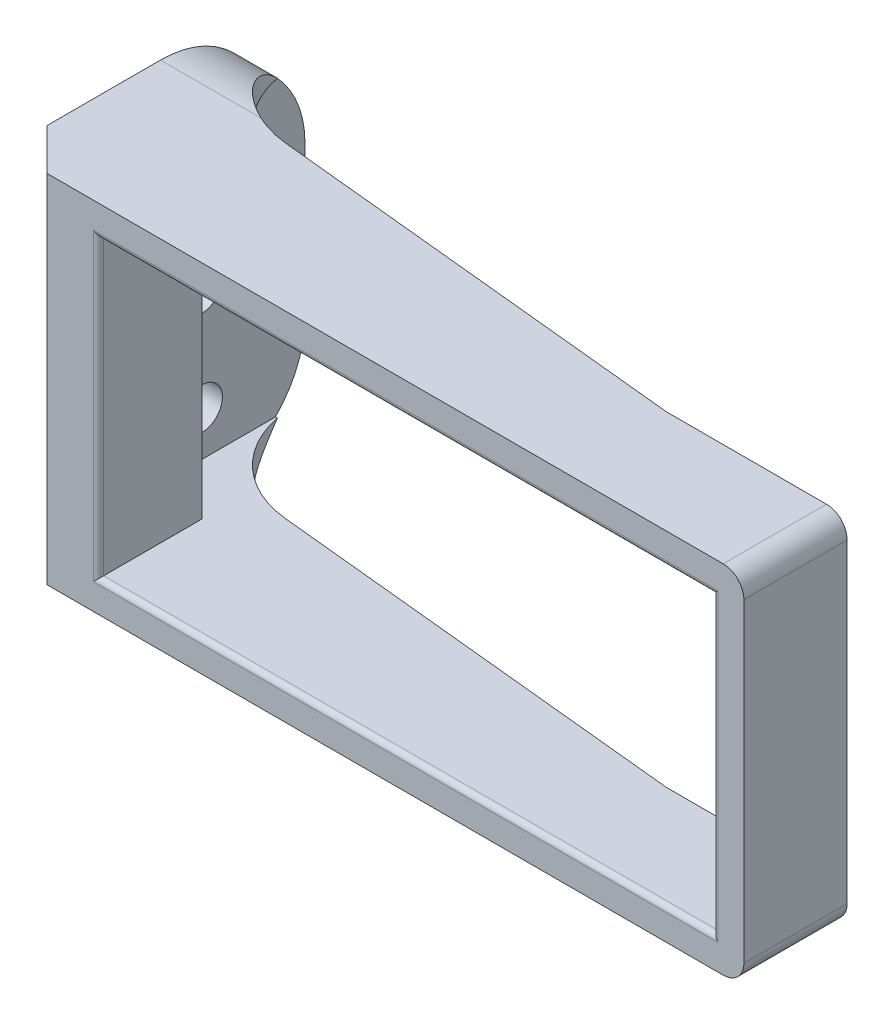
ISO-10303-21;
HEADER;
FILE_DESCRIPTION(('STEP AP214'),'2;1');
FILE_NAME('part.step','',(''),(''),'','','');
FILE_SCHEMA(('AUTOMOTIVE_DESIGN { 1 0 10303 214 1 1 1 1 }'));
ENDSEC;
DATA;
#1=APPLICATION_CONTEXT('core data for automotive mechanical design processes');
#2=APPLICATION_PROTOCOL_DEFINITION('international standard','automotive_design',2000,#1);
#3=PRODUCT_CONTEXT('',#1,'mechanical');
#4=PRODUCT('Part','Part','',(#3));
#5=PRODUCT_RELATED_PRODUCT_CATEGORY('part','',(#4));
#6=PRODUCT_DEFINITION_FORMATION('','',#4);
#7=PRODUCT_DEFINITION_CONTEXT('part definition',#1,'design');
#8=PRODUCT_DEFINITION('design','',#6,#7);
#9=PRODUCT_DEFINITION_SHAPE('','',#8);
#10=(LENGTH_UNIT() NAMED_UNIT(*) SI_UNIT(.MILLI.,.METRE.));
#11=(NAMED_UNIT(*) PLANE_ANGLE_UNIT() SI_UNIT($,.RADIAN.));
#12=(NAMED_UNIT(*) SI_UNIT($,.STERADIAN.) SOLID_ANGLE_UNIT());
#13=UNCERTAINTY_MEASURE_WITH_UNIT(LENGTH_MEASURE(1.E-05),#10,'distance_accuracy_value','');
#14=(GEOMETRIC_REPRESENTATION_CONTEXT(3) GLOBAL_UNCERTAINTY_ASSIGNED_CONTEXT((#13)) GLOBAL_UNIT_ASSIGNED_CONTEXT((#10,
#11,#12)) REPRESENTATION_CONTEXT('',''));
#15=CARTESIAN_POINT('',(0.,0.,0.));
#16=DIRECTION('',(0.,0.,1.));
#17=DIRECTION('',(1.,0.,0.));
#18=AXIS2_PLACEMENT_3D('',#15,#16,#17);
#19=CARTESIAN_POINT('',(0.,0.,2.));
#20=DIRECTION('',(0.,0.,-1.));
#21=DIRECTION('',(-1.,0.,0.));
#22=AXIS2_PLACEMENT_3D('',#19,#20,#21);
#23=PLANE('',#22);
#24=DIRECTION('',(-1.,0.,0.));
#25=VECTOR('',#24,1.);
#26=CARTESIAN_POINT('',(60.75,-31.,2.));
#27=LINE('',#26,#25);
#28=CARTESIAN_POINT('',(58.75,-31.,2.));
#29=VERTEX_POINT('',#28);
#30=CARTESIAN_POINT('',(43.25,-31.,2.));
#31=VERTEX_POINT('',#30);
#32=EDGE_CURVE('E222',#29,#31,#27,.T.);
#33=ORIENTED_EDGE('',*,*,#32,.T.);
#34=DIRECTION('',(0.,-1.,0.));
#35=VECTOR('',#34,1.);
#36=CARTESIAN_POINT('',(43.25,-28.,2.));
#37=LINE('',#36,#35);
#38=CARTESIAN_POINT('',(43.25,-28.,2.));
#39=VERTEX_POINT('',#38);
#40=EDGE_CURVE('E207',#39,#31,#37,.T.);
#41=ORIENTED_EDGE('',*,*,#40,.F.);
#42=DIRECTION('',(-1.,0.,0.));
#43=VECTOR('',#42,1.);
#44=CARTESIAN_POINT('',(57.75,-28.,2.));
#45=LINE('',#44,#43);
#46=CARTESIAN_POINT('',(57.75,-28.,2.));
#47=VERTEX_POINT('',#46);
#48=EDGE_CURVE('E220',#47,#39,#45,.T.);
#49=ORIENTED_EDGE('',*,*,#48,.F.);
#50=DIRECTION('',(0.,-1.,0.));
#51=VECTOR('',#50,1.);
#52=CARTESIAN_POINT('',(57.75,0.5,2.));
#53=LINE('',#52,#51);
#54=CARTESIAN_POINT('',(57.75,0.5,2.));
#55=VERTEX_POINT('',#54);
#56=EDGE_CURVE('E233',#55,#47,#53,.T.);
#57=ORIENTED_EDGE('',*,*,#56,.F.);
#58=DIRECTION('',(1.,0.,0.));
#59=VECTOR('',#58,1.);
#60=CARTESIAN_POINT('',(57.75,0.5,2.));
#61=LINE('',#60,#59);
#62=CARTESIAN_POINT('',(43.25,0.5,2.));
#63=VERTEX_POINT('',#62);
#64=EDGE_CURVE('E238',#63,#55,#61,.T.);
#65=ORIENTED_EDGE('',*,*,#64,.F.);
#66=DIRECTION('',(0.,1.,0.));
#67=VECTOR('',#66,1.);
#68=CARTESIAN_POINT('',(43.25,0.5,2.));
#69=LINE('',#68,#67);
#70=CARTESIAN_POINT('',(43.25,3.5,2.));
#71=VERTEX_POINT('',#70);
#72=EDGE_CURVE('E521',#63,#71,#69,.T.);
#73=ORIENTED_EDGE('',*,*,#72,.T.);
#74=DIRECTION('',(1.,0.,0.));
#75=VECTOR('',#74,1.);
#76=CARTESIAN_POINT('',(60.75,3.5,2.));
#77=LINE('',#76,#75);
#78=CARTESIAN_POINT('',(58.75,3.5,2.));
#79=VERTEX_POINT('',#78);
#80=EDGE_CURVE('E270',#71,#79,#77,.T.);
#81=ORIENTED_EDGE('',*,*,#80,.T.);
#82=CARTESIAN_POINT('',(58.75,1.5,2.));
#83=DIRECTION('',(0.,0.,-1.));
#84=DIRECTION('',(-1.,0.,0.));
#85=AXIS2_PLACEMENT_3D('',#82,#83,#84);
#86=CIRCLE('',#85,2.);
#87=CARTESIAN_POINT('',(60.75,1.5,2.));
#88=VERTEX_POINT('',#87);
#89=EDGE_CURVE('E300',#79,#88,#86,.T.);
#90=ORIENTED_EDGE('',*,*,#89,.T.);
#91=DIRECTION('',(0.,-1.,0.));
#92=VECTOR('',#91,1.);
#93=CARTESIAN_POINT('',(60.75,3.5,2.));
#94=LINE('',#93,#92);
#95=CARTESIAN_POINT('',(60.75,-29.,2.));
#96=VERTEX_POINT('',#95);
#97=EDGE_CURVE('E260',#88,#96,#94,.T.);
#98=ORIENTED_EDGE('',*,*,#97,.T.);
#99=CARTESIAN_POINT('',(58.75,-29.,2.));
#100=DIRECTION('',(0.,0.,-1.));
#101=DIRECTION('',(-1.,0.,0.));
#102=AXIS2_PLACEMENT_3D('',#99,#100,#101);
#103=CIRCLE('',#102,2.);
#104=EDGE_CURVE('E303',#96,#29,#103,.T.);
#105=ORIENTED_EDGE('',*,*,#104,.T.);
#106=EDGE_LOOP('',(#33,#41,#49,#57,#65,#73,#81,#90,#98,#105));
#107=FACE_BOUND('',#106,.T.);
#108=ADVANCED_FACE('F46',(#107),#23,.T.);
#109=DIRECTION('',(0.,1.,0.));
#110=VECTOR('',#109,1.);
#111=CARTESIAN_POINT('',(-1.75,0.5,2.));
#112=LINE('',#111,#110);
#113=CARTESIAN_POINT('',(-1.75000000000001,-28.,2.));
#114=VERTEX_POINT('',#113);
#115=CARTESIAN_POINT('',(-1.75,0.5,2.));
#116=VERTEX_POINT('',#115);
#117=EDGE_CURVE('E232',#114,#116,#112,.T.);
#118=ORIENTED_EDGE('',*,*,#117,.F.);
#119=DIRECTION('',(1.,0.,0.));
#120=VECTOR('',#119,1.);
#121=CARTESIAN_POINT('',(-6.75,-28.,2.));
#122=LINE('',#121,#120);
#123=CARTESIAN_POINT('',(-6.75,-28.,2.));
#124=VERTEX_POINT('',#123);
#125=EDGE_CURVE('E213',#124,#114,#122,.T.);
#126=ORIENTED_EDGE('',*,*,#125,.F.);
#127=DIRECTION('',(0.,1.,0.));
#128=VECTOR('',#127,1.);
#129=CARTESIAN_POINT('',(-6.75,3.5,2.));
#130=LINE('',#129,#128);
#131=CARTESIAN_POINT('',(-6.75,0.5,2.));
#132=VERTEX_POINT('',#131);
#133=EDGE_CURVE('E267',#124,#132,#130,.T.);
#134=ORIENTED_EDGE('',*,*,#133,.T.);
#135=DIRECTION('',(1.,0.,0.));
#136=VECTOR('',#135,1.);
#137=CARTESIAN_POINT('',(-6.75,0.5,2.));
#138=LINE('',#137,#136);
#139=EDGE_CURVE('E514',#132,#116,#138,.T.);
#140=ORIENTED_EDGE('',*,*,#139,.T.);
#141=EDGE_LOOP('',(#118,#126,#134,#140));
#142=FACE_BOUND('',#141,.T.);
#143=ADVANCED_FACE('F448',(#142),#23,.T.);
#144=CARTESIAN_POINT('',(-6.75,0.,0.));
#145=DIRECTION('',(1.,0.,0.));
#146=DIRECTION('',(0.,1.,0.));
#147=AXIS2_PLACEMENT_3D('',#144,#145,#146);
#148=PLANE('',#147);
#149=CARTESIAN_POINT('',(-6.75,-3.75,-2.99999999999999));
#150=DIRECTION('',(-1.,0.,0.));
#151=DIRECTION('',(0.,-1.,0.));
#152=AXIS2_PLACEMENT_3D('',#149,#150,#151);
#153=CIRCLE('',#152,2.);
#154=CARTESIAN_POINT('',(-6.75,-5.75,-2.99999999999999));
#155=VERTEX_POINT('',#154);
#156=EDGE_CURVE('E527',#155,#155,#153,.T.);
#157=ORIENTED_EDGE('',*,*,#156,.T.);
#158=EDGE_LOOP('',(#157));
#159=FACE_BOUND('',#158,.T.);
#160=CARTESIAN_POINT('',(-6.75,-13.75,-2.99999999999999));
#161=DIRECTION('',(-1.,0.,0.));
#162=DIRECTION('',(0.,-1.,0.));
#163=AXIS2_PLACEMENT_3D('',#160,#161,#162);
#164=CIRCLE('',#163,2.);
#165=CARTESIAN_POINT('',(-6.75,-15.75,-2.99999999999999));
#166=VERTEX_POINT('',#165);
#167=EDGE_CURVE('E540',#166,#166,#164,.T.);
#168=ORIENTED_EDGE('',*,*,#167,.T.);
#169=EDGE_LOOP('',(#168));
#170=FACE_BOUND('',#169,.T.);
#171=CARTESIAN_POINT('',(-6.75,-23.75,-2.99999999999999));
#172=DIRECTION('',(-1.,0.,0.));
#173=DIRECTION('',(0.,-1.,0.));
#174=AXIS2_PLACEMENT_3D('',#171,#172,#173);
#175=CIRCLE('',#174,2.);
#176=CARTESIAN_POINT('',(-6.75,-25.75,-2.99999999999999));
#177=VERTEX_POINT('',#176);
#178=EDGE_CURVE('E532',#177,#177,#175,.T.);
#179=ORIENTED_EDGE('',*,*,#178,.T.);
#180=EDGE_LOOP('',(#179));
#181=FACE_BOUND('',#180,.T.);
#182=CARTESIAN_POINT('',(-6.75,-6.5,-3.));
#183=DIRECTION('',(1.,0.,0.));
#184=DIRECTION('',(0.,1.,0.));
#185=AXIS2_PLACEMENT_3D('',#182,#183,#184);
#186=CIRCLE('',#185,10.);
#187=CARTESIAN_POINT('',(-6.75,-6.5,-13.));
#188=VERTEX_POINT('',#187);
#189=CARTESIAN_POINT('',(-6.75,0.5,-10.1414284285428));
#190=VERTEX_POINT('',#189);
#191=EDGE_CURVE('E313',#188,#190,#186,.T.);
#192=ORIENTED_EDGE('',*,*,#191,.T.);
#193=DIRECTION('',(0.,0.,1.));
#194=VECTOR('',#193,1.);
#195=CARTESIAN_POINT('',(-6.75,0.5,-3.));
#196=LINE('',#195,#194);
#197=EDGE_CURVE('E510',#190,#132,#196,.T.);
#198=ORIENTED_EDGE('',*,*,#197,.T.);
#199=ORIENTED_EDGE('',*,*,#133,.F.);
#200=DIRECTION('',(0.,0.,1.));
#201=VECTOR('',#200,1.);
#202=CARTESIAN_POINT('',(-6.75,-28.,-3.));
#203=LINE('',#202,#201);
#204=CARTESIAN_POINT('',(-6.75000000000001,-28.,-10.1414284285428));
#205=VERTEX_POINT('',#204);
#206=EDGE_CURVE('E214',#205,#124,#203,.T.);
#207=ORIENTED_EDGE('',*,*,#206,.F.);
#208=CARTESIAN_POINT('',(-6.75000000000001,-21.,-2.99999999999999));
#209=DIRECTION('',(1.,0.,0.));
#210=DIRECTION('',(0.,1.,0.));
#211=AXIS2_PLACEMENT_3D('',#208,#209,#210);
#212=CIRCLE('',#211,10.);
#213=CARTESIAN_POINT('',(-6.75,-21.,-13.));
#214=VERTEX_POINT('',#213);
#215=EDGE_CURVE('E317',#205,#214,#212,.T.);
#216=ORIENTED_EDGE('',*,*,#215,.T.);
#217=DIRECTION('',(0.,-1.,0.));
#218=VECTOR('',#217,1.);
#219=CARTESIAN_POINT('',(-6.75,3.5,-13.));
#220=LINE('',#219,#218);
#221=EDGE_CURVE('E548',#188,#214,#220,.T.);
#222=ORIENTED_EDGE('',*,*,#221,.F.);
#223=EDGE_LOOP('',(#192,#198,#199,#207,#216,#222));
#224=FACE_BOUND('',#223,.T.);
#225=ADVANCED_FACE('F454',(#159,#170,#181,#224),#148,.T.);
#226=CARTESIAN_POINT('',(0.,0.,12.));
#227=DIRECTION('',(0.,0.,-1.));
#228=DIRECTION('',(-1.,0.,0.));
#229=AXIS2_PLACEMENT_3D('',#226,#227,#228);
#230=PLANE('',#229);
#231=DIRECTION('',(1.,0.,0.));
#232=VECTOR('',#231,1.);
#233=CARTESIAN_POINT('',(57.75,1.,12.));
#234=LINE('',#233,#232);
#235=CARTESIAN_POINT('',(-2.25,1.,12.));
#236=VERTEX_POINT('',#235);
#237=CARTESIAN_POINT('',(58.25,1.,12.));
#238=VERTEX_POINT('',#237);
#239=EDGE_CURVE('E353',#236,#238,#234,.T.);
#240=ORIENTED_EDGE('',*,*,#239,.T.);
#241=DIRECTION('',(0.,-1.,0.));
#242=VECTOR('',#241,1.);
#243=CARTESIAN_POINT('',(58.25,-28.,12.));
#244=LINE('',#243,#242);
#245=CARTESIAN_POINT('',(58.25,-28.5,12.));
#246=VERTEX_POINT('',#245);
#247=EDGE_CURVE('E359',#238,#246,#244,.T.);
#248=ORIENTED_EDGE('',*,*,#247,.T.);
#249=DIRECTION('',(-1.,0.,0.));
#250=VECTOR('',#249,1.);
#251=CARTESIAN_POINT('',(-1.75000000000001,-28.5,12.));
#252=LINE('',#251,#250);
#253=CARTESIAN_POINT('',(-2.25000000000001,-28.5,12.));
#254=VERTEX_POINT('',#253);
#255=EDGE_CURVE('E356',#246,#254,#252,.T.);
#256=ORIENTED_EDGE('',*,*,#255,.T.);
#257=DIRECTION('',(0.,1.,0.));
#258=VECTOR('',#257,1.);
#259=CARTESIAN_POINT('',(-2.25,0.5,12.));
#260=LINE('',#259,#258);
#261=EDGE_CURVE('E350',#254,#236,#260,.T.);
#262=ORIENTED_EDGE('',*,*,#261,.T.);
#263=EDGE_LOOP('',(#240,#248,#256,#262));
#264=FACE_BOUND('',#263,.T.);
#265=DIRECTION('',(1.,0.,0.));
#266=VECTOR('',#265,1.);
#267=CARTESIAN_POINT('',(60.75,3.5,12.));
#268=LINE('',#267,#266);
#269=CARTESIAN_POINT('',(-6.75,3.5,12.));
#270=VERTEX_POINT('',#269);
#271=CARTESIAN_POINT('',(58.75,3.5,12.));
#272=VERTEX_POINT('',#271);
#273=EDGE_CURVE('E264',#270,#272,#268,.T.);
#274=ORIENTED_EDGE('',*,*,#273,.F.);
#275=DIRECTION('',(0.,-1.,0.));
#276=VECTOR('',#275,1.);
#277=CARTESIAN_POINT('',(-6.75,0.,12.));
#278=LINE('',#277,#276);
#279=CARTESIAN_POINT('',(-6.74999999999999,-31.,12.));
#280=VERTEX_POINT('',#279);
#281=EDGE_CURVE('E344',#270,#280,#278,.T.);
#282=ORIENTED_EDGE('',*,*,#281,.T.);
#283=DIRECTION('',(-1.,0.,0.));
#284=VECTOR('',#283,1.);
#285=CARTESIAN_POINT('',(60.75,-31.,12.));
#286=LINE('',#285,#284);
#287=CARTESIAN_POINT('',(58.75,-31.,12.));
#288=VERTEX_POINT('',#287);
#289=EDGE_CURVE('E277',#288,#280,#286,.T.);
#290=ORIENTED_EDGE('',*,*,#289,.F.);
#291=CARTESIAN_POINT('',(58.75,-29.,12.));
#292=DIRECTION('',(0.,0.,-1.));
#293=DIRECTION('',(-1.,0.,0.));
#294=AXIS2_PLACEMENT_3D('',#291,#292,#293);
#295=CIRCLE('',#294,2.);
#296=CARTESIAN_POINT('',(60.75,-29.,12.));
#297=VERTEX_POINT('',#296);
#298=EDGE_CURVE('E290',#288,#297,#295,.F.);
#299=ORIENTED_EDGE('',*,*,#298,.T.);
#300=DIRECTION('',(0.,-1.,0.));
#301=VECTOR('',#300,1.);
#302=CARTESIAN_POINT('',(60.75,3.5,12.));
#303=LINE('',#302,#301);
#304=CARTESIAN_POINT('',(60.75,1.5,12.));
#305=VERTEX_POINT('',#304);
#306=EDGE_CURVE('E259',#305,#297,#303,.T.);
#307=ORIENTED_EDGE('',*,*,#306,.F.);
#308=CARTESIAN_POINT('',(58.75,1.5,12.));
#309=DIRECTION('',(0.,0.,-1.));
#310=DIRECTION('',(-1.,0.,0.));
#311=AXIS2_PLACEMENT_3D('',#308,#309,#310);
#312=CIRCLE('',#311,2.);
#313=EDGE_CURVE('E286',#305,#272,#312,.F.);
#314=ORIENTED_EDGE('',*,*,#313,.T.);
#315=EDGE_LOOP('',(#274,#282,#290,#299,#307,#314));
#316=FACE_BOUND('',#315,.T.);
#317=ADVANCED_FACE('F460',(#264,#316),#230,.F.);
#318=CARTESIAN_POINT('',(60.75,3.5,2.));
#319=DIRECTION('',(-1.,0.,0.));
#320=DIRECTION('',(0.,-1.,0.));
#321=AXIS2_PLACEMENT_3D('',#318,#319,#320);
#322=PLANE('',#321);
#323=ORIENTED_EDGE('',*,*,#306,.T.);
#324=DIRECTION('',(0.,0.,1.));
#325=VECTOR('',#324,1.);
#326=CARTESIAN_POINT('',(60.75,-29.,2.));
#327=LINE('',#326,#325);
#328=EDGE_CURVE('E297',#297,#96,#327,.F.);
#329=ORIENTED_EDGE('',*,*,#328,.T.);
#330=ORIENTED_EDGE('',*,*,#97,.F.);
#331=DIRECTION('',(0.,0.,1.));
#332=VECTOR('',#331,1.);
#333=CARTESIAN_POINT('',(60.75,1.5,2.));
#334=LINE('',#333,#332);
#335=EDGE_CURVE('E293',#88,#305,#334,.T.);
#336=ORIENTED_EDGE('',*,*,#335,.T.);
#337=EDGE_LOOP('',(#323,#329,#330,#336));
#338=FACE_BOUND('',#337,.T.);
#339=ADVANCED_FACE('F463',(#338),#322,.F.);
#340=CARTESIAN_POINT('',(60.75,-31.,2.));
#341=DIRECTION('',(0.,1.,0.));
#342=DIRECTION('',(0.,0.,1.));
#343=AXIS2_PLACEMENT_3D('',#340,#341,#342);
#344=PLANE('',#343);
#345=ORIENTED_EDGE('',*,*,#289,.T.);
#346=DIRECTION('',(0.707106781186549,0.,0.707106781186546));
#347=VECTOR('',#346,1.);
#348=CARTESIAN_POINT('',(-10.75,-31.,8.00000000000002));
#349=LINE('',#348,#347);
#350=CARTESIAN_POINT('',(-10.75,-31.,8.00000000000002));
#351=VERTEX_POINT('',#350);
#352=EDGE_CURVE('E347',#280,#351,#349,.F.);
#353=ORIENTED_EDGE('',*,*,#352,.T.);
#354=DIRECTION('',(0.,0.,1.));
#355=VECTOR('',#354,1.);
#356=CARTESIAN_POINT('',(-10.75,-31.,12.));
#357=LINE('',#356,#355);
#358=CARTESIAN_POINT('',(-10.75,-31.,-2.99999999999999));
#359=VERTEX_POINT('',#358);
#360=EDGE_CURVE('E240',#359,#351,#357,.T.);
#361=ORIENTED_EDGE('',*,*,#360,.F.);
#362=DIRECTION('',(1.,0.,0.));
#363=VECTOR('',#362,1.);
#364=CARTESIAN_POINT('',(60.75,-31.,-2.99999999999999));
#365=LINE('',#364,#363);
#366=CARTESIAN_POINT('',(-1.00438024185059,-31.,-2.99999999999999));
#367=VERTEX_POINT('',#366);
#368=EDGE_CURVE('E310',#359,#367,#365,.T.);
#369=ORIENTED_EDGE('',*,*,#368,.T.);
#370=CARTESIAN_POINT('',(3.25000000000001,-31.,-12.0498756211209));
#371=DIRECTION('',(0.,1.,0.));
#372=DIRECTION('',(0.,0.,1.));
#373=AXIS2_PLACEMENT_3D('',#370,#371,#372);
#374=CIRCLE('',#373,10.);
#375=CARTESIAN_POINT('',(2.25496280979001,-31.,-2.099503719021));
#376=VERTEX_POINT('',#375);
#377=EDGE_CURVE('E503',#367,#376,#374,.T.);
#378=ORIENTED_EDGE('',*,*,#377,.T.);
#379=DIRECTION('',(-0.995037190209989,0.,-0.0995037190209989));
#380=VECTOR('',#379,1.);
#381=CARTESIAN_POINT('',(-6.75,-31.,-3.));
#382=LINE('',#381,#380);
#383=EDGE_CURVE('E391',#31,#376,#382,.T.);
#384=ORIENTED_EDGE('',*,*,#383,.F.);
#385=ORIENTED_EDGE('',*,*,#32,.F.);
#386=DIRECTION('',(0.,0.,1.));
#387=VECTOR('',#386,1.);
#388=CARTESIAN_POINT('',(58.75,-31.,2.));
#389=LINE('',#388,#387);
#390=EDGE_CURVE('E273',#29,#288,#389,.T.);
#391=ORIENTED_EDGE('',*,*,#390,.T.);
#392=EDGE_LOOP('',(#345,#353,#361,#369,#378,#384,#385,#391));
#393=FACE_BOUND('',#392,.T.);
#394=ADVANCED_FACE('F468',(#393),#344,.F.);
#395=CARTESIAN_POINT('',(60.75,3.5,2.));
#396=DIRECTION('',(0.,-1.,0.));
#397=DIRECTION('',(0.,0.,-1.));
#398=AXIS2_PLACEMENT_3D('',#395,#396,#397);
#399=PLANE('',#398);
#400=DIRECTION('',(0.,0.,-1.));
#401=VECTOR('',#400,1.);
#402=CARTESIAN_POINT('',(-10.75,3.5,12.));
#403=LINE('',#402,#401);
#404=CARTESIAN_POINT('',(-10.75,3.5,8.00000000000002));
#405=VERTEX_POINT('',#404);
#406=CARTESIAN_POINT('',(-10.75,3.5,-3.));
#407=VERTEX_POINT('',#406);
#408=EDGE_CURVE('E552',#405,#407,#403,.T.);
#409=ORIENTED_EDGE('',*,*,#408,.F.);
#410=DIRECTION('',(-0.707106781186549,0.,-0.707106781186546));
#411=VECTOR('',#410,1.);
#412=CARTESIAN_POINT('',(-10.75,3.5,8.00000000000002));
#413=LINE('',#412,#411);
#414=EDGE_CURVE('E341',#405,#270,#413,.F.);
#415=ORIENTED_EDGE('',*,*,#414,.T.);
#416=ORIENTED_EDGE('',*,*,#273,.T.);
#417=DIRECTION('',(0.,0.,1.));
#418=VECTOR('',#417,1.);
#419=CARTESIAN_POINT('',(58.75,3.5,2.));
#420=LINE('',#419,#418);
#421=EDGE_CURVE('E306',#272,#79,#420,.F.);
#422=ORIENTED_EDGE('',*,*,#421,.T.);
#423=ORIENTED_EDGE('',*,*,#80,.F.);
#424=DIRECTION('',(-0.995037190209989,0.,-0.0995037190209989));
#425=VECTOR('',#424,1.);
#426=CARTESIAN_POINT('',(-6.75,3.5,-3.));
#427=LINE('',#426,#425);
#428=CARTESIAN_POINT('',(2.25496280979001,3.5,-2.099503719021));
#429=VERTEX_POINT('',#428);
#430=EDGE_CURVE('E224',#71,#429,#427,.T.);
#431=ORIENTED_EDGE('',*,*,#430,.T.);
#432=CARTESIAN_POINT('',(3.25,3.5,-12.0498756211209));
#433=DIRECTION('',(0.,-1.,0.));
#434=DIRECTION('',(0.,0.,-1.));
#435=AXIS2_PLACEMENT_3D('',#432,#433,#434);
#436=CIRCLE('',#435,10.);
#437=CARTESIAN_POINT('',(-1.00438024185096,3.5,-3.));
#438=VERTEX_POINT('',#437);
#439=EDGE_CURVE('E397',#429,#438,#436,.T.);
#440=ORIENTED_EDGE('',*,*,#439,.T.);
#441=DIRECTION('',(1.,0.,0.));
#442=VECTOR('',#441,1.);
#443=CARTESIAN_POINT('',(60.75,3.5,-3.));
#444=LINE('',#443,#442);
#445=EDGE_CURVE('E333',#438,#407,#444,.F.);
#446=ORIENTED_EDGE('',*,*,#445,.T.);
#447=EDGE_LOOP('',(#409,#415,#416,#422,#423,#431,#440,#446));
#448=FACE_BOUND('',#447,.T.);
#449=ADVANCED_FACE('F465',(#448),#399,.F.);
#450=CARTESIAN_POINT('',(57.75,0.5,2.));
#451=DIRECTION('',(-1.,0.,0.));
#452=DIRECTION('',(0.,-1.,0.));
#453=AXIS2_PLACEMENT_3D('',#450,#451,#452);
#454=PLANE('',#453);
#455=DIRECTION('',(0.,0.,1.));
#456=VECTOR('',#455,1.);
#457=CARTESIAN_POINT('',(57.75,-28.,2.));
#458=LINE('',#457,#456);
#459=CARTESIAN_POINT('',(57.75,-28.,11.5));
#460=VERTEX_POINT('',#459);
#461=EDGE_CURVE('E230',#47,#460,#458,.T.);
#462=ORIENTED_EDGE('',*,*,#461,.T.);
#463=DIRECTION('',(0.,-1.,0.));
#464=VECTOR('',#463,1.);
#465=CARTESIAN_POINT('',(57.75,0.5,11.5));
#466=LINE('',#465,#464);
#467=CARTESIAN_POINT('',(57.75,0.5,11.5));
#468=VERTEX_POINT('',#467);
#469=EDGE_CURVE('E363',#460,#468,#466,.F.);
#470=ORIENTED_EDGE('',*,*,#469,.T.);
#471=DIRECTION('',(0.,0.,1.));
#472=VECTOR('',#471,1.);
#473=CARTESIAN_POINT('',(57.75,0.5,2.));
#474=LINE('',#473,#472);
#475=EDGE_CURVE('E246',#55,#468,#474,.T.);
#476=ORIENTED_EDGE('',*,*,#475,.F.);
#477=ORIENTED_EDGE('',*,*,#56,.T.);
#478=EDGE_LOOP('',(#462,#470,#476,#477));
#479=FACE_BOUND('',#478,.T.);
#480=ADVANCED_FACE('F458',(#479),#454,.T.);
#481=CARTESIAN_POINT('',(57.75,-28.,2.));
#482=DIRECTION('',(0.,1.,0.));
#483=DIRECTION('',(0.,0.,1.));
#484=AXIS2_PLACEMENT_3D('',#481,#482,#483);
#485=PLANE('',#484);
#486=DIRECTION('',(0.,0.,1.));
#487=VECTOR('',#486,1.);
#488=CARTESIAN_POINT('',(-1.75000000000001,-28.,2.));
#489=LINE('',#488,#487);
#490=CARTESIAN_POINT('',(-1.75000000000001,-28.,11.5));
#491=VERTEX_POINT('',#490);
#492=EDGE_CURVE('E254',#114,#491,#489,.T.);
#493=ORIENTED_EDGE('',*,*,#492,.T.);
#494=DIRECTION('',(-1.,0.,0.));
#495=VECTOR('',#494,1.);
#496=CARTESIAN_POINT('',(57.75,-28.,11.5));
#497=LINE('',#496,#495);
#498=EDGE_CURVE('E367',#491,#460,#497,.F.);
#499=ORIENTED_EDGE('',*,*,#498,.T.);
#500=ORIENTED_EDGE('',*,*,#461,.F.);
#501=ORIENTED_EDGE('',*,*,#48,.T.);
#502=DIRECTION('',(-0.995037190209989,0.,-0.0995037190209989));
#503=VECTOR('',#502,1.);
#504=CARTESIAN_POINT('',(-6.75,-28.,-3.));
#505=LINE('',#504,#503);
#506=CARTESIAN_POINT('',(2.25496280979001,-28.,-2.099503719021));
#507=VERTEX_POINT('',#506);
#508=EDGE_CURVE('E203',#39,#507,#505,.T.);
#509=ORIENTED_EDGE('',*,*,#508,.T.);
#510=CARTESIAN_POINT('',(3.25,-28.,-12.0498756211209));
#511=DIRECTION('',(0.,1.,0.));
#512=DIRECTION('',(0.,0.,1.));
#513=AXIS2_PLACEMENT_3D('',#510,#511,#512);
#514=CIRCLE('',#513,10.);
#515=CARTESIAN_POINT('',(-6.56620238753974,-28.,-10.1414284285428));
#516=VERTEX_POINT('',#515);
#517=EDGE_CURVE('E70',#507,#516,#514,.F.);
#518=ORIENTED_EDGE('',*,*,#517,.T.);
#519=DIRECTION('',(1.,0.,0.));
#520=VECTOR('',#519,1.);
#521=CARTESIAN_POINT('',(-6.75000000000001,-28.,-10.1414284285428));
#522=LINE('',#521,#520);
#523=EDGE_CURVE('E51',#205,#516,#522,.T.);
#524=ORIENTED_EDGE('',*,*,#523,.F.);
#525=ORIENTED_EDGE('',*,*,#206,.T.);
#526=ORIENTED_EDGE('',*,*,#125,.T.);
#527=EDGE_LOOP('',(#493,#499,#500,#501,#509,#518,#524,#525,#526));
#528=FACE_BOUND('',#527,.T.);
#529=ADVANCED_FACE('F228',(#528),#485,.T.);
#530=CARTESIAN_POINT('',(-1.75,0.5,2.));
#531=DIRECTION('',(1.,0.,0.));
#532=DIRECTION('',(0.,1.,0.));
#533=AXIS2_PLACEMENT_3D('',#530,#531,#532);
#534=PLANE('',#533);
#535=DIRECTION('',(0.,0.,1.));
#536=VECTOR('',#535,1.);
#537=CARTESIAN_POINT('',(-1.75,0.5,2.));
#538=LINE('',#537,#536);
#539=CARTESIAN_POINT('',(-1.75,0.5,11.5));
#540=VERTEX_POINT('',#539);
#541=EDGE_CURVE('E250',#116,#540,#538,.T.);
#542=ORIENTED_EDGE('',*,*,#541,.T.);
#543=DIRECTION('',(0.,1.,0.));
#544=VECTOR('',#543,1.);
#545=CARTESIAN_POINT('',(-1.75000000000001,-28.,11.5));
#546=LINE('',#545,#544);
#547=EDGE_CURVE('E373',#540,#491,#546,.F.);
#548=ORIENTED_EDGE('',*,*,#547,.T.);
#549=ORIENTED_EDGE('',*,*,#492,.F.);
#550=ORIENTED_EDGE('',*,*,#117,.T.);
#551=EDGE_LOOP('',(#542,#548,#549,#550));
#552=FACE_BOUND('',#551,.T.);
#553=ADVANCED_FACE('F592',(#552),#534,.T.);
#554=CARTESIAN_POINT('',(57.75,0.5,2.));
#555=DIRECTION('',(0.,-1.,0.));
#556=DIRECTION('',(0.,0.,-1.));
#557=AXIS2_PLACEMENT_3D('',#554,#555,#556);
#558=PLANE('',#557);
#559=ORIENTED_EDGE('',*,*,#475,.T.);
#560=DIRECTION('',(1.,0.,0.));
#561=VECTOR('',#560,1.);
#562=CARTESIAN_POINT('',(-1.75,0.5,11.5));
#563=LINE('',#562,#561);
#564=EDGE_CURVE('E370',#468,#540,#563,.F.);
#565=ORIENTED_EDGE('',*,*,#564,.T.);
#566=ORIENTED_EDGE('',*,*,#541,.F.);
#567=ORIENTED_EDGE('',*,*,#139,.F.);
#568=ORIENTED_EDGE('',*,*,#197,.F.);
#569=DIRECTION('',(1.,0.,0.));
#570=VECTOR('',#569,1.);
#571=CARTESIAN_POINT('',(-6.56620238753975,0.500000000000002,-10.1414284285428));
#572=LINE('',#571,#570);
#573=CARTESIAN_POINT('',(-6.56620238753975,0.500000000000002,-10.1414284285428));
#574=VERTEX_POINT('',#573);
#575=EDGE_CURVE('E11',#190,#574,#572,.T.);
#576=ORIENTED_EDGE('',*,*,#575,.T.);
#577=CARTESIAN_POINT('',(3.25,0.5,-12.0498756211209));
#578=DIRECTION('',(0.,-1.,0.));
#579=DIRECTION('',(0.,0.,-1.));
#580=AXIS2_PLACEMENT_3D('',#577,#578,#579);
#581=CIRCLE('',#580,10.);
#582=CARTESIAN_POINT('',(2.25496280979001,0.5,-2.099503719021));
#583=VERTEX_POINT('',#582);
#584=EDGE_CURVE('E408',#574,#583,#581,.F.);
#585=ORIENTED_EDGE('',*,*,#584,.T.);
#586=DIRECTION('',(-0.995037190209989,0.,-0.0995037190209989));
#587=VECTOR('',#586,1.);
#588=CARTESIAN_POINT('',(-6.75,0.5,-3.));
#589=LINE('',#588,#587);
#590=EDGE_CURVE('E517',#63,#583,#589,.T.);
#591=ORIENTED_EDGE('',*,*,#590,.F.);
#592=ORIENTED_EDGE('',*,*,#64,.T.);
#593=EDGE_LOOP('',(#559,#565,#566,#567,#568,#576,#585,#591,#592));
#594=FACE_BOUND('',#593,.T.);
#595=ADVANCED_FACE('F479',(#594),#558,.T.);
#596=CARTESIAN_POINT('',(58.75,-29.,2.));
#597=DIRECTION('',(0.,0.,1.));
#598=DIRECTION('',(1.,0.,0.));
#599=AXIS2_PLACEMENT_3D('',#596,#597,#598);
#600=CYLINDRICAL_SURFACE('',#599,2.);
#601=ORIENTED_EDGE('',*,*,#104,.F.);
#602=ORIENTED_EDGE('',*,*,#328,.F.);
#603=ORIENTED_EDGE('',*,*,#298,.F.);
#604=ORIENTED_EDGE('',*,*,#390,.F.);
#605=EDGE_LOOP('',(#601,#602,#603,#604));
#606=FACE_BOUND('',#605,.T.);
#607=ADVANCED_FACE('F476',(#606),#600,.T.);
#608=CARTESIAN_POINT('',(58.75,1.5,2.));
#609=DIRECTION('',(0.,0.,1.));
#610=DIRECTION('',(1.,0.,0.));
#611=AXIS2_PLACEMENT_3D('',#608,#609,#610);
#612=CYLINDRICAL_SURFACE('',#611,2.);
#613=ORIENTED_EDGE('',*,*,#89,.F.);
#614=ORIENTED_EDGE('',*,*,#421,.F.);
#615=ORIENTED_EDGE('',*,*,#313,.F.);
#616=ORIENTED_EDGE('',*,*,#335,.F.);
#617=EDGE_LOOP('',(#613,#614,#615,#616));
#618=FACE_BOUND('',#617,.T.);
#619=ADVANCED_FACE('F478',(#618),#612,.T.);
#620=CARTESIAN_POINT('',(-10.75,0.,0.));
#621=DIRECTION('',(1.,0.,0.));
#622=DIRECTION('',(0.,1.,0.));
#623=AXIS2_PLACEMENT_3D('',#620,#621,#622);
#624=PLANE('',#623);
#625=ORIENTED_EDGE('',*,*,#360,.T.);
#626=DIRECTION('',(0.,1.,0.));
#627=VECTOR('',#626,1.);
#628=CARTESIAN_POINT('',(-10.75,0.,8.00000000000002));
#629=LINE('',#628,#627);
#630=EDGE_CURVE('E337',#351,#405,#629,.T.);
#631=ORIENTED_EDGE('',*,*,#630,.T.);
#632=ORIENTED_EDGE('',*,*,#408,.T.);
#633=CARTESIAN_POINT('',(-10.75,-6.5,-3.));
#634=DIRECTION('',(1.,0.,0.));
#635=DIRECTION('',(0.,1.,0.));
#636=AXIS2_PLACEMENT_3D('',#633,#634,#635);
#637=CIRCLE('',#636,10.);
#638=CARTESIAN_POINT('',(-10.75,-6.5,-13.));
#639=VERTEX_POINT('',#638);
#640=EDGE_CURVE('E327',#407,#639,#637,.F.);
#641=ORIENTED_EDGE('',*,*,#640,.T.);
#642=DIRECTION('',(0.,-1.,0.));
#643=VECTOR('',#642,1.);
#644=CARTESIAN_POINT('',(-10.75,3.5,-13.));
#645=LINE('',#644,#643);
#646=CARTESIAN_POINT('',(-10.75,-21.,-13.));
#647=VERTEX_POINT('',#646);
#648=EDGE_CURVE('E555',#639,#647,#645,.T.);
#649=ORIENTED_EDGE('',*,*,#648,.T.);
#650=CARTESIAN_POINT('',(-10.75,-21.,-2.99999999999999));
#651=DIRECTION('',(1.,0.,0.));
#652=DIRECTION('',(0.,1.,0.));
#653=AXIS2_PLACEMENT_3D('',#650,#651,#652);
#654=CIRCLE('',#653,10.);
#655=EDGE_CURVE('E330',#647,#359,#654,.F.);
#656=ORIENTED_EDGE('',*,*,#655,.T.);
#657=EDGE_LOOP('',(#625,#631,#632,#641,#649,#656));
#658=FACE_BOUND('',#657,.T.);
#659=CARTESIAN_POINT('',(-10.75,-13.75,-2.99999999999999));
#660=DIRECTION('',(-1.,0.,0.));
#661=DIRECTION('',(0.,-1.,0.));
#662=AXIS2_PLACEMENT_3D('',#659,#660,#661);
#663=CIRCLE('',#662,2.);
#664=CARTESIAN_POINT('',(-10.75,-15.75,-2.99999999999999));
#665=VERTEX_POINT('',#664);
#666=EDGE_CURVE('E544',#665,#665,#663,.T.);
#667=ORIENTED_EDGE('',*,*,#666,.F.);
#668=EDGE_LOOP('',(#667));
#669=FACE_BOUND('',#668,.T.);
#670=CARTESIAN_POINT('',(-10.75,-23.75,-2.99999999999999));
#671=DIRECTION('',(-1.,0.,0.));
#672=DIRECTION('',(0.,-1.,0.));
#673=AXIS2_PLACEMENT_3D('',#670,#671,#672);
#674=CIRCLE('',#673,2.);
#675=CARTESIAN_POINT('',(-10.75,-25.75,-2.99999999999999));
#676=VERTEX_POINT('',#675);
#677=EDGE_CURVE('E536',#676,#676,#674,.T.);
#678=ORIENTED_EDGE('',*,*,#677,.F.);
#679=EDGE_LOOP('',(#678));
#680=FACE_BOUND('',#679,.T.);
#681=CARTESIAN_POINT('',(-10.75,-3.75,-2.99999999999999));
#682=DIRECTION('',(-1.,0.,0.));
#683=DIRECTION('',(0.,-1.,0.));
#684=AXIS2_PLACEMENT_3D('',#681,#682,#683);
#685=CIRCLE('',#684,2.);
#686=CARTESIAN_POINT('',(-10.75,-5.75,-2.99999999999999));
#687=VERTEX_POINT('',#686);
#688=EDGE_CURVE('E528',#687,#687,#685,.T.);
#689=ORIENTED_EDGE('',*,*,#688,.F.);
#690=EDGE_LOOP('',(#689));
#691=FACE_BOUND('',#690,.T.);
#692=ADVANCED_FACE('F482',(#658,#669,#680,#691),#624,.F.);
#693=CARTESIAN_POINT('',(-10.75,3.5,-13.));
#694=DIRECTION('',(0.,0.,1.));
#695=DIRECTION('',(0.,-1.,0.));
#696=AXIS2_PLACEMENT_3D('',#693,#694,#695);
#697=PLANE('',#696);
#698=ORIENTED_EDGE('',*,*,#221,.T.);
#699=DIRECTION('',(1.,0.,0.));
#700=VECTOR('',#699,1.);
#701=CARTESIAN_POINT('',(-10.75,-21.,-13.));
#702=LINE('',#701,#700);
#703=EDGE_CURVE('E324',#214,#647,#702,.F.);
#704=ORIENTED_EDGE('',*,*,#703,.T.);
#705=ORIENTED_EDGE('',*,*,#648,.F.);
#706=DIRECTION('',(1.,0.,0.));
#707=VECTOR('',#706,1.);
#708=CARTESIAN_POINT('',(-10.75,-6.5,-13.));
#709=LINE('',#708,#707);
#710=EDGE_CURVE('E320',#639,#188,#709,.T.);
#711=ORIENTED_EDGE('',*,*,#710,.T.);
#712=EDGE_LOOP('',(#698,#704,#705,#711));
#713=FACE_BOUND('',#712,.T.);
#714=ADVANCED_FACE('F488',(#713),#697,.F.);
#715=CARTESIAN_POINT('',(-10.75,-13.75,-2.99999999999999));
#716=DIRECTION('',(1.,0.,0.));
#717=DIRECTION('',(0.,1.,0.));
#718=AXIS2_PLACEMENT_3D('',#715,#716,#717);
#719=CYLINDRICAL_SURFACE('',#718,2.);
#720=ORIENTED_EDGE('',*,*,#666,.T.);
#721=EDGE_LOOP('',(#720));
#722=FACE_BOUND('',#721,.T.);
#723=ORIENTED_EDGE('',*,*,#167,.F.);
#724=EDGE_LOOP('',(#723));
#725=FACE_BOUND('',#724,.T.);
#726=ADVANCED_FACE('F766',(#722,#725),#719,.F.);
#727=CARTESIAN_POINT('',(-10.75,-23.75,-2.99999999999999));
#728=DIRECTION('',(1.,0.,0.));
#729=DIRECTION('',(0.,1.,0.));
#730=AXIS2_PLACEMENT_3D('',#727,#728,#729);
#731=CYLINDRICAL_SURFACE('',#730,2.);
#732=ORIENTED_EDGE('',*,*,#677,.T.);
#733=EDGE_LOOP('',(#732));
#734=FACE_BOUND('',#733,.T.);
#735=ORIENTED_EDGE('',*,*,#178,.F.);
#736=EDGE_LOOP('',(#735));
#737=FACE_BOUND('',#736,.T.);
#738=ADVANCED_FACE('F773',(#734,#737),#731,.F.);
#739=CARTESIAN_POINT('',(-10.75,-3.75,-2.99999999999999));
#740=DIRECTION('',(1.,0.,0.));
#741=DIRECTION('',(0.,1.,0.));
#742=AXIS2_PLACEMENT_3D('',#739,#740,#741);
#743=CYLINDRICAL_SURFACE('',#742,2.);
#744=ORIENTED_EDGE('',*,*,#688,.T.);
#745=EDGE_LOOP('',(#744));
#746=FACE_BOUND('',#745,.T.);
#747=ORIENTED_EDGE('',*,*,#156,.F.);
#748=EDGE_LOOP('',(#747));
#749=FACE_BOUND('',#748,.T.);
#750=ADVANCED_FACE('F664',(#746,#749),#743,.F.);
#751=CARTESIAN_POINT('',(60.75,-21.,-2.99999999999999));
#752=DIRECTION('',(1.,0.,0.));
#753=DIRECTION('',(0.,0.,-1.));
#754=AXIS2_PLACEMENT_3D('',#751,#752,#753);
#755=CYLINDRICAL_SURFACE('',#754,10.);
#756=ORIENTED_EDGE('',*,*,#655,.F.);
#757=ORIENTED_EDGE('',*,*,#703,.F.);
#758=ORIENTED_EDGE('',*,*,#215,.F.);
#759=ORIENTED_EDGE('',*,*,#523,.T.);
#760=CARTESIAN_POINT('',(-6.56620238753974,-28.,-10.1414284285428));
#761=CARTESIAN_POINT('',(-6.55116292473307,-28.0789194380524,-10.0640733436832));
#762=CARTESIAN_POINT('',(-6.53494329375606,-28.1564329087448,-9.98552778137803));
#763=CARTESIAN_POINT('',(-6.49997252691012,-28.308556332906,-9.82620948223078));
#764=CARTESIAN_POINT('',(-6.48122120949472,-28.3831660776548,-9.74543658599808));
#765=CARTESIAN_POINT('',(-6.42090943291593,-28.6025110120895,-9.49999612709469));
#766=CARTESIAN_POINT('',(-6.3752962524339,-28.7427344359695,-9.33223376005545));
#767=CARTESIAN_POINT('',(-6.27216910323507,-29.0100937812267,-8.99044465008642));
#768=CARTESIAN_POINT('',(-6.21467028790719,-29.1372460613497,-8.81642611446784));
#769=CARTESIAN_POINT('',(-6.08679181984846,-29.3780501689092,-8.46386601089939));
#770=CARTESIAN_POINT('',(-6.01641433332355,-29.4917042614613,-8.28532520794441));
#771=CARTESIAN_POINT('',(-5.85989702988928,-29.708222303987,-7.92068095593636));
#772=CARTESIAN_POINT('',(-5.77336373353898,-29.8106843336406,-7.73450730933314));
#773=CARTESIAN_POINT('',(-5.58559474434908,-30.0009059171274,-7.36204438577035));
#774=CARTESIAN_POINT('',(-5.48435798208569,-30.0886644005303,-7.1757551013823));
#775=CARTESIAN_POINT('',(-5.26731533581345,-30.2497176695881,-6.80570736334658));
#776=CARTESIAN_POINT('',(-5.1515236159221,-30.3230263412903,-6.62194663935973));
#777=CARTESIAN_POINT('',(-4.90567156131261,-30.4559824048385,-6.25910201014112));
#778=CARTESIAN_POINT('',(-4.77561074132906,-30.515629331861,-6.08001826422124));
#779=CARTESIAN_POINT('',(-4.48728925619649,-30.6279601564124,-5.70991813110109));
#780=CARTESIAN_POINT('',(-4.32750051171355,-30.6792268156025,-5.51966099136552));
#781=CARTESIAN_POINT('',(-3.99240857801693,-30.7680171807349,-5.14988941154768));
#782=CARTESIAN_POINT('',(-3.81710227655481,-30.8055381220045,-4.97037713864517));
#783=CARTESIAN_POINT('',(-3.45202789154324,-30.8688547745043,-4.6238215594499));
#784=CARTESIAN_POINT('',(-3.26223485988684,-30.8946297002163,-4.45680079093438));
#785=CARTESIAN_POINT('',(-2.86996940604193,-30.9364321068714,-4.13722843097034));
#786=CARTESIAN_POINT('',(-2.66750065113821,-30.952462392848,-3.98467268638915));
#787=CARTESIAN_POINT('',(-2.22882557880625,-30.9781772198568,-3.67961433987179));
#788=CARTESIAN_POINT('',(-1.99133249708831,-30.9869940993222,-3.52888124174159));
#789=CARTESIAN_POINT('',(-1.62679584407312,-30.9951703063239,-3.31852681462084));
#790=CARTESIAN_POINT('',(-1.50419477860828,-30.9970556193649,-3.25117105341536));
#791=CARTESIAN_POINT('',(-1.25627728659485,-30.9994689816985,-3.12166119167385));
#792=CARTESIAN_POINT('',(-1.13096113180624,-30.9999971662023,-3.05950657354298));
#793=CARTESIAN_POINT('',(-1.00438024185039,-31.,-3.00000000000028));
#794=B_SPLINE_CURVE_WITH_KNOTS('',3,(#760,#761,#762,#763,#764,#765,#766,#767,#768,#769,#770,
#771,#772,#773,#774,#775,#776,#777,#778,#779,#780,#781,#782,#783,#784,#785,#786,#787,#788,#789,
#790,#791,#792,#793),.UNSPECIFIED.,.F.,.F.,(4,2,2,2,2,2,2,2,2,2,2,2,2,2,2,2,4),(0.,
0.334537762405071,0.669099527165525,1.33833919771117,2.00673083756388,2.67501015640841,
3.36241608806997,4.04987204172907,4.73666410494441,5.42347953191862,6.18341095254461,
6.94349513417456,7.70491917218579,8.46612392732981,9.30917715977266,9.72876123980737,
10.148303514903),.UNSPECIFIED.);
#795=EDGE_CURVE('E613',#516,#367,#794,.T.);
#796=ORIENTED_EDGE('',*,*,#795,.T.);
#797=ORIENTED_EDGE('',*,*,#368,.F.);
#798=EDGE_LOOP('',(#756,#757,#758,#759,#796,#797));
#799=FACE_BOUND('',#798,.T.);
#800=ADVANCED_FACE('F419',(#799),#755,.T.);
#801=CARTESIAN_POINT('',(-10.75,-6.5,-3.));
#802=DIRECTION('',(1.,0.,0.));
#803=DIRECTION('',(0.,0.,-1.));
#804=AXIS2_PLACEMENT_3D('',#801,#802,#803);
#805=CYLINDRICAL_SURFACE('',#804,10.);
#806=ORIENTED_EDGE('',*,*,#640,.F.);
#807=ORIENTED_EDGE('',*,*,#445,.F.);
#808=CARTESIAN_POINT('',(-1.00438024185096,3.5,-3.));
#809=CARTESIAN_POINT('',(-1.2323526907686,3.49997162243469,-3.10714044319572));
#810=CARTESIAN_POINT('',(-1.4562825290016,3.49827728320889,-3.22295712168532));
#811=CARTESIAN_POINT('',(-1.8948789488858,3.48967265171259,-3.47120256667769));
#812=CARTESIAN_POINT('',(-2.10953743047024,3.48275789224085,-3.60364547955856));
#813=CARTESIAN_POINT('',(-2.52828287166989,3.46180872704377,-3.88439425963021));
#814=CARTESIAN_POINT('',(-2.7323560949499,3.4477653133424,-4.0327200092614));
#815=CARTESIAN_POINT('',(-3.12810399309348,3.41053283782199,-4.34383097309447));
#816=CARTESIAN_POINT('',(-3.31978503048704,3.38734851333822,-4.50660866368185));
#817=CARTESIAN_POINT('',(-3.7516687451089,3.32008879152989,-4.90223787343402));
#818=CARTESIAN_POINT('',(-3.98652200099993,3.27161057398033,-5.14025104334003));
#819=CARTESIAN_POINT('',(-4.42825645696558,3.15001435036087,-5.63473438056483));
#820=CARTESIAN_POINT('',(-4.63517626217494,3.07693084845491,-5.89117830838978));
#821=CARTESIAN_POINT('',(-4.95342200025773,2.93205850598122,-6.32711186444567));
#822=CARTESIAN_POINT('',(-5.07331435630043,2.86829461491343,-6.50308744561153));
#823=CARTESIAN_POINT('',(-5.2995277825717,2.72757507933614,-6.85854486718152));
#824=CARTESIAN_POINT('',(-5.40584656032242,2.6506172115894,-7.03802729397951));
#825=CARTESIAN_POINT('',(-5.60483442046397,2.48287104445122,-7.39859547931249));
#826=CARTESIAN_POINT('',(-5.69747772785926,2.39205726862754,-7.57968360035529));
#827=CARTESIAN_POINT('',(-5.8689878906579,2.19655460500879,-7.94085905032577));
#828=CARTESIAN_POINT('',(-5.94785663276718,2.09186762089097,-8.1209465130372));
#829=CARTESIAN_POINT('',(-6.08594280306794,1.87858438742421,-8.46225230532003));
#830=CARTESIAN_POINT('',(-6.14627729145392,1.77113708698545,-8.62373982259151));
#831=CARTESIAN_POINT('',(-6.25645659102333,1.54517023069502,-8.94250915957297));
#832=CARTESIAN_POINT('',(-6.30630055974593,1.42664978669655,-9.09979064062462));
#833=CARTESIAN_POINT('',(-6.39620923429491,1.17914542906376,-9.40857279247797));
#834=CARTESIAN_POINT('',(-6.43628191465987,1.05017016314246,-9.56007809155628));
#835=CARTESIAN_POINT('',(-6.50761444768009,0.782341629205802,-9.85620283244105));
#836=CARTESIAN_POINT('',(-6.53887688440622,0.643491272579073,-10.0008242829364));
#837=CARTESIAN_POINT('',(-6.56620238753975,0.500000000000002,-10.1414284285428));
#838=B_SPLINE_CURVE_WITH_KNOTS('',3,(#808,#809,#810,#811,#812,#813,#814,#815,#816,#817,#818,
#819,#820,#821,#822,#823,#824,#825,#826,#827,#828,#829,#830,#831,#832,#833,#834,#835,#836,#837),
.UNSPECIFIED.,.F.,.F.,(4,2,2,2,2,2,2,2,2,2,2,2,2,2,4),(0.,0.755544757575315,1.51173678133107,
2.26888673900908,3.02564481360333,4.03679297720471,5.04652906601044,5.71260706532706,
6.37879741193089,7.04622776152654,7.71356662119008,8.32235204988216,8.93118634958998,
9.53952209212813,10.1476792218274),.UNSPECIFIED.);
#839=EDGE_CURVE('E63',#438,#574,#838,.T.);
#840=ORIENTED_EDGE('',*,*,#839,.T.);
#841=ORIENTED_EDGE('',*,*,#575,.F.);
#842=ORIENTED_EDGE('',*,*,#191,.F.);
#843=ORIENTED_EDGE('',*,*,#710,.F.);
#844=EDGE_LOOP('',(#806,#807,#840,#841,#842,#843));
#845=FACE_BOUND('',#844,.T.);
#846=ADVANCED_FACE('F413',(#845),#805,.T.);
#847=CARTESIAN_POINT('',(-6.75,0.5,-3.));
#848=DIRECTION('',(0.0995037190209989,0.,-0.995037190209989));
#849=DIRECTION('',(-0.995037190209989,0.,-0.0995037190209989));
#850=AXIS2_PLACEMENT_3D('',#847,#848,#849);
#851=PLANE('',#850);
#852=ORIENTED_EDGE('',*,*,#590,.T.);
#853=DIRECTION('',(0.,1.,0.));
#854=VECTOR('',#853,1.);
#855=CARTESIAN_POINT('',(2.25496280979001,3.5,-2.099503719021));
#856=LINE('',#855,#854);
#857=EDGE_CURVE('E376',#583,#429,#856,.T.);
#858=ORIENTED_EDGE('',*,*,#857,.T.);
#859=ORIENTED_EDGE('',*,*,#430,.F.);
#860=ORIENTED_EDGE('',*,*,#72,.F.);
#861=EDGE_LOOP('',(#852,#858,#859,#860));
#862=FACE_BOUND('',#861,.T.);
#863=ADVANCED_FACE('F418',(#862),#851,.T.);
#864=CARTESIAN_POINT('',(-6.75,-28.,-3.));
#865=DIRECTION('',(-0.0995037190209989,0.,0.995037190209989));
#866=DIRECTION('',(0.995037190209989,0.,0.0995037190209989));
#867=AXIS2_PLACEMENT_3D('',#864,#865,#866);
#868=PLANE('',#867);
#869=ORIENTED_EDGE('',*,*,#383,.T.);
#870=DIRECTION('',(0.,-1.,0.));
#871=VECTOR('',#870,1.);
#872=CARTESIAN_POINT('',(2.25496280979002,-28.,-2.099503719021));
#873=LINE('',#872,#871);
#874=EDGE_CURVE('E210',#376,#507,#873,.F.);
#875=ORIENTED_EDGE('',*,*,#874,.T.);
#876=ORIENTED_EDGE('',*,*,#508,.F.);
#877=ORIENTED_EDGE('',*,*,#40,.T.);
#878=EDGE_LOOP('',(#869,#875,#876,#877));
#879=FACE_BOUND('',#878,.T.);
#880=ADVANCED_FACE('F206',(#879),#868,.F.);
#881=CARTESIAN_POINT('',(-10.75,0.,8.00000000000002));
#882=DIRECTION('',(0.707106781186546,0.,-0.707106781186549));
#883=DIRECTION('',(0.,1.,0.));
#884=AXIS2_PLACEMENT_3D('',#881,#882,#883);
#885=PLANE('',#884);
#886=ORIENTED_EDGE('',*,*,#352,.F.);
#887=ORIENTED_EDGE('',*,*,#281,.F.);
#888=ORIENTED_EDGE('',*,*,#414,.F.);
#889=ORIENTED_EDGE('',*,*,#630,.F.);
#890=EDGE_LOOP('',(#886,#887,#888,#889));
#891=FACE_BOUND('',#890,.T.);
#892=ADVANCED_FACE('F423',(#891),#885,.F.);
#893=CARTESIAN_POINT('',(-2.25,0.,11.5));
#894=DIRECTION('',(0.,-1.,0.));
#895=DIRECTION('',(1.,0.,0.));
#896=AXIS2_PLACEMENT_3D('',#893,#894,#895);
#897=CYLINDRICAL_SURFACE('',#896,0.5);
#898=CARTESIAN_POINT('',(-2.25000000000001,-28.5,11.5));
#899=DIRECTION('',(0.707106781186547,-0.707106781186548,0.));
#900=DIRECTION('',(0.707106781186548,0.707106781186547,0.));
#901=AXIS2_PLACEMENT_3D('',#898,#899,#900);
#902=ELLIPSE('',#901,0.707106781186548,0.5);
#903=EDGE_CURVE('E383',#491,#254,#902,.T.);
#904=ORIENTED_EDGE('',*,*,#903,.F.);
#905=ORIENTED_EDGE('',*,*,#547,.F.);
#906=CARTESIAN_POINT('',(-2.25,1.,11.5));
#907=DIRECTION('',(-0.707106781186548,-0.707106781186547,0.));
#908=DIRECTION('',(-0.707106781186547,0.707106781186548,0.));
#909=AXIS2_PLACEMENT_3D('',#906,#907,#908);
#910=ELLIPSE('',#909,0.707106781186547,0.5);
#911=EDGE_CURVE('E387',#236,#540,#910,.F.);
#912=ORIENTED_EDGE('',*,*,#911,.F.);
#913=ORIENTED_EDGE('',*,*,#261,.F.);
#914=EDGE_LOOP('',(#904,#905,#912,#913));
#915=FACE_BOUND('',#914,.T.);
#916=ADVANCED_FACE('F428',(#915),#897,.T.);
#917=CARTESIAN_POINT('',(0.,1.,11.5));
#918=DIRECTION('',(-1.,0.,0.));
#919=DIRECTION('',(0.,0.,1.));
#920=AXIS2_PLACEMENT_3D('',#917,#918,#919);
#921=CYLINDRICAL_SURFACE('',#920,0.5);
#922=ORIENTED_EDGE('',*,*,#911,.T.);
#923=ORIENTED_EDGE('',*,*,#564,.F.);
#924=CARTESIAN_POINT('',(58.25,1.,11.5));
#925=DIRECTION('',(-0.707106781186547,0.707106781186548,0.));
#926=DIRECTION('',(0.707106781186548,0.707106781186547,0.));
#927=AXIS2_PLACEMENT_3D('',#924,#925,#926);
#928=ELLIPSE('',#927,0.707106781186548,0.5);
#929=EDGE_CURVE('E380',#238,#468,#928,.F.);
#930=ORIENTED_EDGE('',*,*,#929,.F.);
#931=ORIENTED_EDGE('',*,*,#239,.F.);
#932=EDGE_LOOP('',(#922,#923,#930,#931));
#933=FACE_BOUND('',#932,.T.);
#934=ADVANCED_FACE('F437',(#933),#921,.T.);
#935=CARTESIAN_POINT('',(0.,-28.5,11.5));
#936=DIRECTION('',(1.,0.,0.));
#937=DIRECTION('',(0.,0.,-1.));
#938=AXIS2_PLACEMENT_3D('',#935,#936,#937);
#939=CYLINDRICAL_SURFACE('',#938,0.5);
#940=ORIENTED_EDGE('',*,*,#903,.T.);
#941=ORIENTED_EDGE('',*,*,#255,.F.);
#942=CARTESIAN_POINT('',(58.25,-28.5,11.5));
#943=DIRECTION('',(0.707106781186548,0.707106781186547,0.));
#944=DIRECTION('',(-0.707106781186547,0.707106781186548,0.));
#945=AXIS2_PLACEMENT_3D('',#942,#943,#944);
#946=ELLIPSE('',#945,0.707106781186547,0.5);
#947=EDGE_CURVE('E377',#460,#246,#946,.T.);
#948=ORIENTED_EDGE('',*,*,#947,.F.);
#949=ORIENTED_EDGE('',*,*,#498,.F.);
#950=EDGE_LOOP('',(#940,#941,#948,#949));
#951=FACE_BOUND('',#950,.T.);
#952=ADVANCED_FACE('F433',(#951),#939,.T.);
#953=CARTESIAN_POINT('',(58.25,0.,11.5));
#954=DIRECTION('',(0.,1.,0.));
#955=DIRECTION('',(-1.,0.,0.));
#956=AXIS2_PLACEMENT_3D('',#953,#954,#955);
#957=CYLINDRICAL_SURFACE('',#956,0.5);
#958=ORIENTED_EDGE('',*,*,#929,.T.);
#959=ORIENTED_EDGE('',*,*,#469,.F.);
#960=ORIENTED_EDGE('',*,*,#947,.T.);
#961=ORIENTED_EDGE('',*,*,#247,.F.);
#962=EDGE_LOOP('',(#958,#959,#960,#961));
#963=FACE_BOUND('',#962,.T.);
#964=ADVANCED_FACE('F430',(#963),#957,.T.);
#965=CARTESIAN_POINT('',(3.25,0.500000000000002,-12.0498756211209));
#966=DIRECTION('',(0.,-1.,0.));
#967=DIRECTION('',(1.,0.,0.));
#968=AXIS2_PLACEMENT_3D('',#965,#966,#967);
#969=CYLINDRICAL_SURFACE('',#968,10.);
#970=ORIENTED_EDGE('',*,*,#584,.F.);
#971=ORIENTED_EDGE('',*,*,#839,.F.);
#972=ORIENTED_EDGE('',*,*,#439,.F.);
#973=ORIENTED_EDGE('',*,*,#857,.F.);
#974=EDGE_LOOP('',(#970,#971,#972,#973));
#975=FACE_BOUND('',#974,.T.);
#976=ADVANCED_FACE('F410',(#975),#969,.F.);
#977=CARTESIAN_POINT('',(3.25,0.,-12.0498756211209));
#978=DIRECTION('',(0.,-1.,0.));
#979=DIRECTION('',(1.,0.,0.));
#980=AXIS2_PLACEMENT_3D('',#977,#978,#979);
#981=CYLINDRICAL_SURFACE('',#980,10.);
#982=ORIENTED_EDGE('',*,*,#517,.F.);
#983=ORIENTED_EDGE('',*,*,#874,.F.);
#984=ORIENTED_EDGE('',*,*,#377,.F.);
#985=ORIENTED_EDGE('',*,*,#795,.F.);
#986=EDGE_LOOP('',(#982,#983,#984,#985));
#987=FACE_BOUND('',#986,.T.);
#988=ADVANCED_FACE('F48',(#987),#981,.F.);
#989=CLOSED_SHELL('',(#108,#143,#225,#317,#339,#394,#449,#480,#529,#553,#595,#607,#619,#692,
#714,#726,#738,#750,#800,#846,#863,#880,#892,#916,#934,#952,#964,#976,#988));
#990=MANIFOLD_SOLID_BREP('B2',#989);
#991=ADVANCED_BREP_SHAPE_REPRESENTATION('',(#18,#990),#14);
#992=SHAPE_DEFINITION_REPRESENTATION(#9,#991);
ENDSEC;
END-ISO-10303-21;
